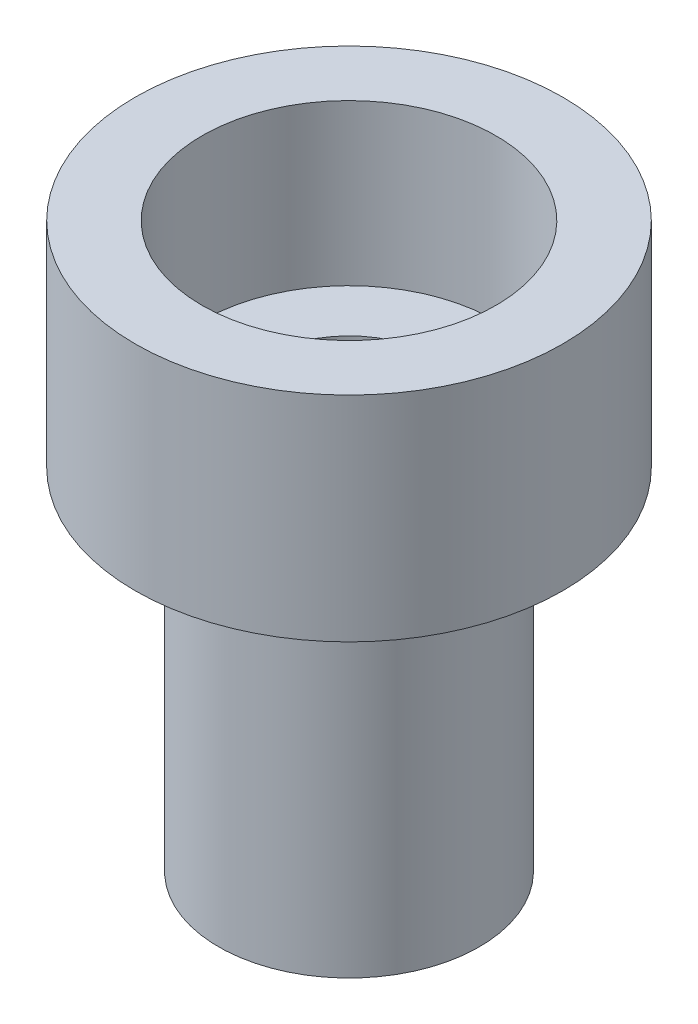
ISO-10303-21;
HEADER;
FILE_DESCRIPTION(('STEP AP214'),'2;1');
FILE_NAME('part.step','',(''),(''),'','','');
FILE_SCHEMA(('AUTOMOTIVE_DESIGN { 1 0 10303 214 1 1 1 1 }'));
ENDSEC;
DATA;
#1=APPLICATION_CONTEXT('core data for automotive mechanical design processes');
#2=APPLICATION_PROTOCOL_DEFINITION('international standard','automotive_design',2000,#1);
#3=PRODUCT_CONTEXT('',#1,'mechanical');
#4=PRODUCT('Part','Part','',(#3));
#5=PRODUCT_RELATED_PRODUCT_CATEGORY('part','',(#4));
#6=PRODUCT_DEFINITION_FORMATION('','',#4);
#7=PRODUCT_DEFINITION_CONTEXT('part definition',#1,'design');
#8=PRODUCT_DEFINITION('design','',#6,#7);
#9=PRODUCT_DEFINITION_SHAPE('','',#8);
#10=(LENGTH_UNIT() NAMED_UNIT(*) SI_UNIT(.MILLI.,.METRE.));
#11=(NAMED_UNIT(*) PLANE_ANGLE_UNIT() SI_UNIT($,.RADIAN.));
#12=(NAMED_UNIT(*) SI_UNIT($,.STERADIAN.) SOLID_ANGLE_UNIT());
#13=UNCERTAINTY_MEASURE_WITH_UNIT(LENGTH_MEASURE(1.E-05),#10,'distance_accuracy_value','');
#14=(GEOMETRIC_REPRESENTATION_CONTEXT(3) GLOBAL_UNCERTAINTY_ASSIGNED_CONTEXT((#13)) GLOBAL_UNIT_ASSIGNED_CONTEXT((#10,
#11,#12)) REPRESENTATION_CONTEXT('',''));
#15=CARTESIAN_POINT('',(0.,0.,0.));
#16=DIRECTION('',(0.,0.,1.));
#17=DIRECTION('',(1.,0.,0.));
#18=AXIS2_PLACEMENT_3D('',#15,#16,#17);
#19=CARTESIAN_POINT('',(0.,4.,0.));
#20=DIRECTION('',(0.,-1.,0.));
#21=DIRECTION('',(0.,0.,-1.));
#22=AXIS2_PLACEMENT_3D('',#19,#20,#21);
#23=CYLINDRICAL_SURFACE('',#22,4.);
#24=CARTESIAN_POINT('',(0.,4.,0.));
#25=DIRECTION('',(0.,1.,0.));
#26=DIRECTION('',(0.,0.,1.));
#27=AXIS2_PLACEMENT_3D('',#24,#25,#26);
#28=CIRCLE('',#27,4.);
#29=CARTESIAN_POINT('',(0.,4.,4.));
#30=VERTEX_POINT('',#29);
#31=EDGE_CURVE('E37',#30,#30,#28,.T.);
#32=ORIENTED_EDGE('',*,*,#31,.F.);
#33=EDGE_LOOP('',(#32));
#34=FACE_BOUND('',#33,.T.);
#35=CARTESIAN_POINT('',(0.,0.,0.));
#36=DIRECTION('',(0.,1.,0.));
#37=DIRECTION('',(0.,0.,1.));
#38=AXIS2_PLACEMENT_3D('',#35,#36,#37);
#39=CIRCLE('',#38,4.);
#40=CARTESIAN_POINT('',(0.,0.,4.));
#41=VERTEX_POINT('',#40);
#42=EDGE_CURVE('E33',#41,#41,#39,.T.);
#43=ORIENTED_EDGE('',*,*,#42,.T.);
#44=EDGE_LOOP('',(#43));
#45=FACE_BOUND('',#44,.T.);
#46=ADVANCED_FACE('F30',(#34,#45),#23,.T.);
#47=CARTESIAN_POINT('',(0.,4.,0.));
#48=DIRECTION('',(0.,1.,0.));
#49=DIRECTION('',(0.,0.,1.));
#50=AXIS2_PLACEMENT_3D('',#47,#48,#49);
#51=PLANE('',#50);
#52=CARTESIAN_POINT('',(0.,4.,0.));
#53=DIRECTION('',(0.,1.,0.));
#54=DIRECTION('',(0.,0.,1.));
#55=AXIS2_PLACEMENT_3D('',#52,#53,#54);
#56=CIRCLE('',#55,2.75);
#57=CARTESIAN_POINT('',(0.,4.,2.75));
#58=VERTEX_POINT('',#57);
#59=EDGE_CURVE('E47',#58,#58,#56,.T.);
#60=ORIENTED_EDGE('',*,*,#59,.F.);
#61=EDGE_LOOP('',(#60));
#62=FACE_BOUND('',#61,.T.);
#63=ORIENTED_EDGE('',*,*,#31,.T.);
#64=EDGE_LOOP('',(#63));
#65=FACE_BOUND('',#64,.T.);
#66=ADVANCED_FACE('F80',(#62,#65),#51,.T.);
#67=CARTESIAN_POINT('',(0.,0.,0.));
#68=DIRECTION('',(0.,1.,0.));
#69=DIRECTION('',(0.,0.,1.));
#70=AXIS2_PLACEMENT_3D('',#67,#68,#69);
#71=PLANE('',#70);
#72=CARTESIAN_POINT('',(0.,0.,0.));
#73=DIRECTION('',(0.,-1.,0.));
#74=DIRECTION('',(0.,0.,-1.));
#75=AXIS2_PLACEMENT_3D('',#72,#73,#74);
#76=CIRCLE('',#75,2.44);
#77=CARTESIAN_POINT('',(0.,0.,-2.44));
#78=VERTEX_POINT('',#77);
#79=EDGE_CURVE('E10',#78,#78,#76,.T.);
#80=ORIENTED_EDGE('',*,*,#79,.F.);
#81=EDGE_LOOP('',(#80));
#82=FACE_BOUND('',#81,.T.);
#83=ORIENTED_EDGE('',*,*,#42,.F.);
#84=EDGE_LOOP('',(#83));
#85=FACE_BOUND('',#84,.T.);
#86=ADVANCED_FACE('F83',(#82,#85),#71,.F.);
#87=CARTESIAN_POINT('',(0.,-6.55,0.));
#88=DIRECTION('',(0.,1.,0.));
#89=DIRECTION('',(0.,0.,1.));
#90=AXIS2_PLACEMENT_3D('',#87,#88,#89);
#91=CYLINDRICAL_SURFACE('',#90,2.44);
#92=CARTESIAN_POINT('',(0.,-6.55,0.));
#93=DIRECTION('',(0.,-1.,0.));
#94=DIRECTION('',(0.,0.,-1.));
#95=AXIS2_PLACEMENT_3D('',#92,#93,#94);
#96=CIRCLE('',#95,2.44);
#97=CARTESIAN_POINT('',(0.,-6.55,-2.44));
#98=VERTEX_POINT('',#97);
#99=EDGE_CURVE('E43',#98,#98,#96,.T.);
#100=ORIENTED_EDGE('',*,*,#99,.F.);
#101=EDGE_LOOP('',(#100));
#102=FACE_BOUND('',#101,.T.);
#103=ORIENTED_EDGE('',*,*,#79,.T.);
#104=EDGE_LOOP('',(#103));
#105=FACE_BOUND('',#104,.T.);
#106=ADVANCED_FACE('F93',(#102,#105),#91,.T.);
#107=CARTESIAN_POINT('',(0.,-6.55,0.));
#108=DIRECTION('',(0.,-1.,0.));
#109=DIRECTION('',(0.,0.,-1.));
#110=AXIS2_PLACEMENT_3D('',#107,#108,#109);
#111=PLANE('',#110);
#112=CARTESIAN_POINT('',(0.,-6.55,0.));
#113=DIRECTION('',(0.,1.,0.));
#114=DIRECTION('',(0.,0.,1.));
#115=AXIS2_PLACEMENT_3D('',#112,#113,#114);
#116=CIRCLE('',#115,1.6);
#117=CARTESIAN_POINT('',(0.,-6.55,1.6));
#118=VERTEX_POINT('',#117);
#119=EDGE_CURVE('E50',#118,#118,#116,.T.);
#120=ORIENTED_EDGE('',*,*,#119,.T.);
#121=EDGE_LOOP('',(#120));
#122=FACE_BOUND('',#121,.T.);
#123=ORIENTED_EDGE('',*,*,#99,.T.);
#124=EDGE_LOOP('',(#123));
#125=FACE_BOUND('',#124,.T.);
#126=ADVANCED_FACE('F59',(#122,#125),#111,.T.);
#127=CARTESIAN_POINT('',(0.,1.,0.));
#128=DIRECTION('',(0.,1.,0.));
#129=DIRECTION('',(0.,0.,1.));
#130=AXIS2_PLACEMENT_3D('',#127,#128,#129);
#131=CYLINDRICAL_SURFACE('',#130,2.75);
#132=CARTESIAN_POINT('',(0.,1.,0.));
#133=DIRECTION('',(0.,1.,0.));
#134=DIRECTION('',(0.,0.,1.));
#135=AXIS2_PLACEMENT_3D('',#132,#133,#134);
#136=CIRCLE('',#135,2.75);
#137=CARTESIAN_POINT('',(0.,1.,2.75));
#138=VERTEX_POINT('',#137);
#139=EDGE_CURVE('E46',#138,#138,#136,.T.);
#140=ORIENTED_EDGE('',*,*,#139,.F.);
#141=EDGE_LOOP('',(#140));
#142=FACE_BOUND('',#141,.T.);
#143=ORIENTED_EDGE('',*,*,#59,.T.);
#144=EDGE_LOOP('',(#143));
#145=FACE_BOUND('',#144,.T.);
#146=ADVANCED_FACE('F71',(#142,#145),#131,.F.);
#147=CARTESIAN_POINT('',(0.,1.,0.));
#148=DIRECTION('',(0.,1.,0.));
#149=DIRECTION('',(0.,0.,1.));
#150=AXIS2_PLACEMENT_3D('',#147,#148,#149);
#151=PLANE('',#150);
#152=CARTESIAN_POINT('',(0.,1.,0.));
#153=DIRECTION('',(0.,1.,0.));
#154=DIRECTION('',(0.,0.,1.));
#155=AXIS2_PLACEMENT_3D('',#152,#153,#154);
#156=CIRCLE('',#155,1.6);
#157=CARTESIAN_POINT('',(0.,1.,1.6));
#158=VERTEX_POINT('',#157);
#159=EDGE_CURVE('E53',#158,#158,#156,.T.);
#160=ORIENTED_EDGE('',*,*,#159,.F.);
#161=EDGE_LOOP('',(#160));
#162=FACE_BOUND('',#161,.T.);
#163=ORIENTED_EDGE('',*,*,#139,.T.);
#164=EDGE_LOOP('',(#163));
#165=FACE_BOUND('',#164,.T.);
#166=ADVANCED_FACE('F65',(#162,#165),#151,.T.);
#167=CARTESIAN_POINT('',(0.,-6.55,0.));
#168=DIRECTION('',(0.,1.,0.));
#169=DIRECTION('',(0.,0.,1.));
#170=AXIS2_PLACEMENT_3D('',#167,#168,#169);
#171=CYLINDRICAL_SURFACE('',#170,1.6);
#172=ORIENTED_EDGE('',*,*,#119,.F.);
#173=EDGE_LOOP('',(#172));
#174=FACE_BOUND('',#173,.T.);
#175=ORIENTED_EDGE('',*,*,#159,.T.);
#176=EDGE_LOOP('',(#175));
#177=FACE_BOUND('',#176,.T.);
#178=ADVANCED_FACE('F62',(#174,#177),#171,.F.);
#179=CLOSED_SHELL('',(#46,#66,#86,#106,#126,#146,#166,#178));
#180=MANIFOLD_SOLID_BREP('B2',#179);
#181=ADVANCED_BREP_SHAPE_REPRESENTATION('',(#18,#180),#14);
#182=SHAPE_DEFINITION_REPRESENTATION(#9,#181);
ENDSEC;
END-ISO-10303-21;
